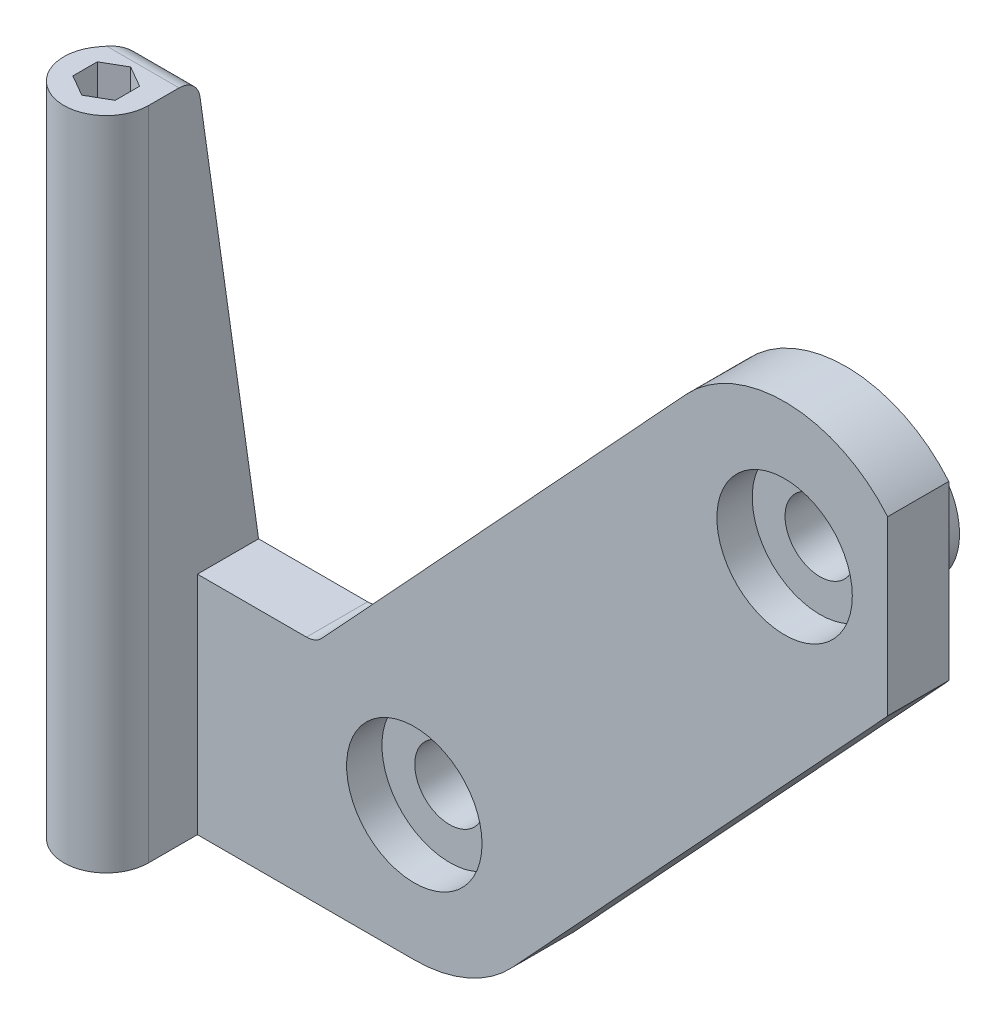
ISO-10303-21;
HEADER;
FILE_DESCRIPTION(('STEP AP214'),'2;1');
FILE_NAME('part.step','',(''),(''),'','','');
FILE_SCHEMA(('AUTOMOTIVE_DESIGN { 1 0 10303 214 1 1 1 1 }'));
ENDSEC;
DATA;
#1=APPLICATION_CONTEXT('core data for automotive mechanical design processes');
#2=APPLICATION_PROTOCOL_DEFINITION('international standard','automotive_design',2000,#1);
#3=PRODUCT_CONTEXT('',#1,'mechanical');
#4=PRODUCT('Part','Part','',(#3));
#5=PRODUCT_RELATED_PRODUCT_CATEGORY('part','',(#4));
#6=PRODUCT_DEFINITION_FORMATION('','',#4);
#7=PRODUCT_DEFINITION_CONTEXT('part definition',#1,'design');
#8=PRODUCT_DEFINITION('design','',#6,#7);
#9=PRODUCT_DEFINITION_SHAPE('','',#8);
#10=(LENGTH_UNIT() NAMED_UNIT(*) SI_UNIT(.MILLI.,.METRE.));
#11=(NAMED_UNIT(*) PLANE_ANGLE_UNIT() SI_UNIT($,.RADIAN.));
#12=(NAMED_UNIT(*) SI_UNIT($,.STERADIAN.) SOLID_ANGLE_UNIT());
#13=UNCERTAINTY_MEASURE_WITH_UNIT(LENGTH_MEASURE(1.E-05),#10,'distance_accuracy_value','');
#14=(GEOMETRIC_REPRESENTATION_CONTEXT(3) GLOBAL_UNCERTAINTY_ASSIGNED_CONTEXT((#13)) GLOBAL_UNIT_ASSIGNED_CONTEXT((#10,
#11,#12)) REPRESENTATION_CONTEXT('',''));
#15=CARTESIAN_POINT('',(0.,0.,0.));
#16=DIRECTION('',(0.,0.,1.));
#17=DIRECTION('',(1.,0.,0.));
#18=AXIS2_PLACEMENT_3D('',#15,#16,#17);
#19=CARTESIAN_POINT('',(-4.65938028001538,4.31424100001424,-18.2594591380867));
#20=DIRECTION('',(0.,1.,0.));
#21=DIRECTION('',(-1.,0.,0.));
#22=AXIS2_PLACEMENT_3D('',#19,#20,#21);
#23=PLANE('',#22);
#24=DIRECTION('',(-1.,0.,0.));
#25=VECTOR('',#24,1.);
#26=CARTESIAN_POINT('',(-4.65938028001538,4.31424100001424,1.445));
#27=LINE('',#26,#25);
#28=CARTESIAN_POINT('',(-5.0962965387542,4.31424100001424,1.445));
#29=VERTEX_POINT('',#28);
#30=CARTESIAN_POINT('',(-10.25,4.31424100001424,1.445));
#31=VERTEX_POINT('',#30);
#32=EDGE_CURVE('E230',#29,#31,#27,.T.);
#33=ORIENTED_EDGE('',*,*,#32,.F.);
#34=DIRECTION('',(0.,0.,-1.));
#35=VECTOR('',#34,1.);
#36=CARTESIAN_POINT('',(-5.0962965387542,4.31424100001424,-18.2594591380867));
#37=LINE('',#36,#35);
#38=CARTESIAN_POINT('',(-5.0962965387542,4.31424100001424,-1.445));
#39=VERTEX_POINT('',#38);
#40=EDGE_CURVE('E359',#29,#39,#37,.T.);
#41=ORIENTED_EDGE('',*,*,#40,.T.);
#42=DIRECTION('',(1.,0.,0.));
#43=VECTOR('',#42,1.);
#44=CARTESIAN_POINT('',(-4.65938028001538,4.31424100001424,-1.445));
#45=LINE('',#44,#43);
#46=CARTESIAN_POINT('',(-10.25,4.31424100001424,-1.445));
#47=VERTEX_POINT('',#46);
#48=EDGE_CURVE('E211',#47,#39,#45,.T.);
#49=ORIENTED_EDGE('',*,*,#48,.F.);
#50=DIRECTION('',(0.,0.,-1.));
#51=VECTOR('',#50,1.);
#52=CARTESIAN_POINT('',(-10.25,4.31424100001424,1.445));
#53=LINE('',#52,#51);
#54=EDGE_CURVE('E374',#31,#47,#53,.T.);
#55=ORIENTED_EDGE('',*,*,#54,.F.);
#56=EDGE_LOOP('',(#33,#41,#49,#55));
#57=FACE_BOUND('',#56,.T.);
#58=ADVANCED_FACE('F41',(#57),#23,.T.);
#59=CARTESIAN_POINT('',(0.,0.,1.445));
#60=DIRECTION('',(0.,0.,1.));
#61=DIRECTION('',(1.,0.,0.));
#62=AXIS2_PLACEMENT_3D('',#59,#60,#61);
#63=PLANE('',#62);
#64=CARTESIAN_POINT('',(0.,0.,1.445));
#65=DIRECTION('',(0.,0.,1.));
#66=DIRECTION('',(1.,0.,0.));
#67=AXIS2_PLACEMENT_3D('',#64,#65,#66);
#68=CIRCLE('',#67,3.2);
#69=CARTESIAN_POINT('',(3.2,0.,1.445));
#70=VERTEX_POINT('',#69);
#71=EDGE_CURVE('E282',#70,#70,#68,.T.);
#72=ORIENTED_EDGE('',*,*,#71,.F.);
#73=EDGE_LOOP('',(#72));
#74=FACE_BOUND('',#73,.T.);
#75=CARTESIAN_POINT('',(17.5,18.9,1.445));
#76=DIRECTION('',(0.,0.,1.));
#77=DIRECTION('',(1.,0.,0.));
#78=AXIS2_PLACEMENT_3D('',#75,#76,#77);
#79=CIRCLE('',#78,3.2);
#80=CARTESIAN_POINT('',(20.7,18.9,1.445));
#81=VERTEX_POINT('',#80);
#82=EDGE_CURVE('E290',#81,#81,#79,.T.);
#83=ORIENTED_EDGE('',*,*,#82,.F.);
#84=EDGE_LOOP('',(#83));
#85=FACE_BOUND('',#84,.T.);
#86=DIRECTION('',(-0.679408031498305,-0.733760674018169,0.));
#87=VECTOR('',#86,1.);
#88=CARTESIAN_POINT('',(-4.65938028001538,4.31424100001424,1.445));
#89=LINE('',#88,#87);
#90=CARTESIAN_POINT('',(12.8406197199846,23.2142410000142,1.445));
#91=VERTEX_POINT('',#90);
#92=CARTESIAN_POINT('',(-4.36253586473603,4.63483296851593,1.445));
#93=VERTEX_POINT('',#92);
#94=EDGE_CURVE('E306',#91,#93,#89,.T.);
#95=ORIENTED_EDGE('',*,*,#94,.T.);
#96=CARTESIAN_POINT('',(-5.0962965387542,5.31424100001424,1.445));
#97=DIRECTION('',(0.,0.,1.));
#98=DIRECTION('',(1.,0.,0.));
#99=AXIS2_PLACEMENT_3D('',#96,#97,#98);
#100=CIRCLE('',#99,1.);
#101=EDGE_CURVE('E11',#93,#29,#100,.F.);
#102=ORIENTED_EDGE('',*,*,#101,.T.);
#103=ORIENTED_EDGE('',*,*,#32,.T.);
#104=DIRECTION('',(0.,-1.,0.));
#105=VECTOR('',#104,1.);
#106=CARTESIAN_POINT('',(-10.25,24.65,1.445));
#107=LINE('',#106,#105);
#108=CARTESIAN_POINT('',(-10.25,-6.35,1.445));
#109=VERTEX_POINT('',#108);
#110=EDGE_CURVE('E343',#31,#109,#107,.T.);
#111=ORIENTED_EDGE('',*,*,#110,.T.);
#112=DIRECTION('',(1.,0.,0.));
#113=VECTOR('',#112,1.);
#114=CARTESIAN_POINT('',(0.,-6.35,1.445));
#115=LINE('',#114,#113);
#116=CARTESIAN_POINT('',(0.,-6.35,1.445));
#117=VERTEX_POINT('',#116);
#118=EDGE_CURVE('E237',#109,#117,#115,.T.);
#119=ORIENTED_EDGE('',*,*,#118,.T.);
#120=CARTESIAN_POINT('',(0.,0.,1.445));
#121=DIRECTION('',(0.,0.,1.));
#122=DIRECTION('',(1.,0.,0.));
#123=AXIS2_PLACEMENT_3D('',#120,#121,#122);
#124=CIRCLE('',#123,6.35);
#125=CARTESIAN_POINT('',(4.65938028001538,-4.31424100001424,1.445));
#126=VERTEX_POINT('',#125);
#127=EDGE_CURVE('E294',#117,#126,#124,.T.);
#128=ORIENTED_EDGE('',*,*,#127,.T.);
#129=DIRECTION('',(0.679408031498305,0.733760674018169,0.));
#130=VECTOR('',#129,1.);
#131=CARTESIAN_POINT('',(4.65938028001538,-4.31424100001424,1.445));
#132=LINE('',#131,#130);
#133=CARTESIAN_POINT('',(22.1593802800154,14.5857589999858,1.445));
#134=VERTEX_POINT('',#133);
#135=EDGE_CURVE('E297',#126,#134,#132,.T.);
#136=ORIENTED_EDGE('',*,*,#135,.T.);
#137=CARTESIAN_POINT('',(17.5,18.9,1.445));
#138=DIRECTION('',(0.,0.,1.));
#139=DIRECTION('',(1.,0.,0.));
#140=AXIS2_PLACEMENT_3D('',#137,#138,#139);
#141=CIRCLE('',#140,6.35);
#142=CARTESIAN_POINT('',(22.37,14.8250030674858,1.445));
#143=VERTEX_POINT('',#142);
#144=EDGE_CURVE('E302',#134,#143,#141,.T.);
#145=ORIENTED_EDGE('',*,*,#144,.T.);
#146=DIRECTION('',(0.,-1.,0.));
#147=VECTOR('',#146,1.);
#148=CARTESIAN_POINT('',(22.37,14.8250030674858,1.445));
#149=LINE('',#148,#147);
#150=CARTESIAN_POINT('',(22.37,22.9749969325142,1.445));
#151=VERTEX_POINT('',#150);
#152=EDGE_CURVE('E246',#151,#143,#149,.T.);
#153=ORIENTED_EDGE('',*,*,#152,.F.);
#154=EDGE_CURVE('E301',#151,#91,#141,.T.);
#155=ORIENTED_EDGE('',*,*,#154,.T.);
#156=EDGE_LOOP('',(#95,#102,#103,#111,#119,#128,#136,#145,#153,#155));
#157=FACE_BOUND('',#156,.T.);
#158=ADVANCED_FACE('F380',(#74,#85,#157),#63,.T.);
#159=CARTESIAN_POINT('',(17.5,18.9,1.445));
#160=DIRECTION('',(0.,0.,-1.));
#161=DIRECTION('',(-1.,0.,0.));
#162=AXIS2_PLACEMENT_3D('',#159,#160,#161);
#163=CYLINDRICAL_SURFACE('',#162,6.35);
#164=ORIENTED_EDGE('',*,*,#154,.F.);
#165=DIRECTION('',(0.,0.,1.));
#166=VECTOR('',#165,1.);
#167=CARTESIAN_POINT('',(22.37,22.9749969325142,-3.625));
#168=LINE('',#167,#166);
#169=CARTESIAN_POINT('',(22.37,22.9749969325142,-1.445));
#170=VERTEX_POINT('',#169);
#171=EDGE_CURVE('E260',#170,#151,#168,.T.);
#172=ORIENTED_EDGE('',*,*,#171,.F.);
#173=CARTESIAN_POINT('',(17.5,18.9,-1.445));
#174=DIRECTION('',(0.,0.,1.));
#175=DIRECTION('',(1.,0.,0.));
#176=AXIS2_PLACEMENT_3D('',#173,#174,#175);
#177=CIRCLE('',#176,6.35);
#178=CARTESIAN_POINT('',(12.8406197199846,23.2142410000142,-1.445));
#179=VERTEX_POINT('',#178);
#180=EDGE_CURVE('E315',#170,#179,#177,.T.);
#181=ORIENTED_EDGE('',*,*,#180,.T.);
#182=DIRECTION('',(0.,0.,-1.));
#183=VECTOR('',#182,1.);
#184=CARTESIAN_POINT('',(12.8406197199846,23.2142410000142,1.445));
#185=LINE('',#184,#183);
#186=EDGE_CURVE('E309',#91,#179,#185,.T.);
#187=ORIENTED_EDGE('',*,*,#186,.F.);
#188=EDGE_LOOP('',(#164,#172,#181,#187));
#189=FACE_BOUND('',#188,.T.);
#190=ADVANCED_FACE('F388',(#189),#163,.T.);
#191=CARTESIAN_POINT('',(0.,0.,1.445));
#192=DIRECTION('',(0.,0.,-1.));
#193=DIRECTION('',(-1.,0.,0.));
#194=AXIS2_PLACEMENT_3D('',#191,#192,#193);
#195=CYLINDRICAL_SURFACE('',#194,6.35);
#196=ORIENTED_EDGE('',*,*,#127,.F.);
#197=DIRECTION('',(0.,0.,1.));
#198=VECTOR('',#197,1.);
#199=CARTESIAN_POINT('',(0.,-6.35,-18.2594591380867));
#200=LINE('',#199,#198);
#201=CARTESIAN_POINT('',(0.,-6.35,-1.445));
#202=VERTEX_POINT('',#201);
#203=EDGE_CURVE('E218',#202,#117,#200,.T.);
#204=ORIENTED_EDGE('',*,*,#203,.F.);
#205=CARTESIAN_POINT('',(0.,0.,-1.445));
#206=DIRECTION('',(0.,0.,1.));
#207=DIRECTION('',(1.,0.,0.));
#208=AXIS2_PLACEMENT_3D('',#205,#206,#207);
#209=CIRCLE('',#208,6.35);
#210=CARTESIAN_POINT('',(4.65938028001538,-4.31424100001424,-1.445));
#211=VERTEX_POINT('',#210);
#212=EDGE_CURVE('E281',#202,#211,#209,.T.);
#213=ORIENTED_EDGE('',*,*,#212,.T.);
#214=DIRECTION('',(0.,0.,-1.));
#215=VECTOR('',#214,1.);
#216=CARTESIAN_POINT('',(4.65938028001538,-4.31424100001424,1.445));
#217=LINE('',#216,#215);
#218=EDGE_CURVE('E329',#126,#211,#217,.T.);
#219=ORIENTED_EDGE('',*,*,#218,.F.);
#220=EDGE_LOOP('',(#196,#204,#213,#219));
#221=FACE_BOUND('',#220,.T.);
#222=ADVANCED_FACE('F403',(#221),#195,.T.);
#223=CARTESIAN_POINT('',(4.65938028001538,-4.31424100001424,1.445));
#224=DIRECTION('',(-0.733760674018169,0.679408031498305,0.));
#225=DIRECTION('',(-0.679408031498305,-0.733760674018169,0.));
#226=AXIS2_PLACEMENT_3D('',#223,#224,#225);
#227=PLANE('',#226);
#228=DIRECTION('',(0.679408031498305,0.733760674018169,0.));
#229=VECTOR('',#228,1.);
#230=CARTESIAN_POINT('',(4.65938028001538,-4.31424100001424,-1.445));
#231=LINE('',#230,#229);
#232=CARTESIAN_POINT('',(22.1593802800154,14.5857589999858,-1.445));
#233=VERTEX_POINT('',#232);
#234=EDGE_CURVE('E312',#211,#233,#231,.T.);
#235=ORIENTED_EDGE('',*,*,#234,.T.);
#236=DIRECTION('',(0.,0.,-1.));
#237=VECTOR('',#236,1.);
#238=CARTESIAN_POINT('',(22.1593802800154,14.5857589999858,1.445));
#239=LINE('',#238,#237);
#240=EDGE_CURVE('E325',#134,#233,#239,.T.);
#241=ORIENTED_EDGE('',*,*,#240,.F.);
#242=ORIENTED_EDGE('',*,*,#135,.F.);
#243=ORIENTED_EDGE('',*,*,#218,.T.);
#244=EDGE_LOOP('',(#235,#241,#242,#243));
#245=FACE_BOUND('',#244,.T.);
#246=ADVANCED_FACE('F400',(#245),#227,.F.);
#247=CARTESIAN_POINT('',(22.37,14.8250030674858,-1.445));
#248=VERTEX_POINT('',#247);
#249=EDGE_CURVE('E316',#233,#248,#177,.T.);
#250=ORIENTED_EDGE('',*,*,#249,.T.);
#251=DIRECTION('',(0.,0.,1.));
#252=VECTOR('',#251,1.);
#253=CARTESIAN_POINT('',(22.37,14.8250030674858,-3.625));
#254=LINE('',#253,#252);
#255=EDGE_CURVE('E261',#248,#143,#254,.T.);
#256=ORIENTED_EDGE('',*,*,#255,.T.);
#257=ORIENTED_EDGE('',*,*,#144,.F.);
#258=ORIENTED_EDGE('',*,*,#240,.T.);
#259=EDGE_LOOP('',(#250,#256,#257,#258));
#260=FACE_BOUND('',#259,.T.);
#261=ADVANCED_FACE('F395',(#260),#163,.T.);
#262=CARTESIAN_POINT('',(-4.65938028001538,4.31424100001424,1.445));
#263=DIRECTION('',(0.733760674018169,-0.679408031498305,0.));
#264=DIRECTION('',(0.679408031498305,0.733760674018169,0.));
#265=AXIS2_PLACEMENT_3D('',#262,#263,#264);
#266=PLANE('',#265);
#267=DIRECTION('',(-0.679408031498305,-0.733760674018169,0.));
#268=VECTOR('',#267,1.);
#269=CARTESIAN_POINT('',(-4.65938028001538,4.31424100001424,-1.445));
#270=LINE('',#269,#268);
#271=CARTESIAN_POINT('',(-4.36253586473603,4.63483296851593,-1.445));
#272=VERTEX_POINT('',#271);
#273=EDGE_CURVE('E298',#179,#272,#270,.T.);
#274=ORIENTED_EDGE('',*,*,#273,.T.);
#275=DIRECTION('',(0.,0.,-1.));
#276=VECTOR('',#275,1.);
#277=CARTESIAN_POINT('',(-4.36253586473603,4.63483296851593,1.445));
#278=LINE('',#277,#276);
#279=EDGE_CURVE('E57',#272,#93,#278,.F.);
#280=ORIENTED_EDGE('',*,*,#279,.T.);
#281=ORIENTED_EDGE('',*,*,#94,.F.);
#282=ORIENTED_EDGE('',*,*,#186,.T.);
#283=EDGE_LOOP('',(#274,#280,#281,#282));
#284=FACE_BOUND('',#283,.T.);
#285=ADVANCED_FACE('F384',(#284),#266,.F.);
#286=CARTESIAN_POINT('',(0.,0.,-1.445));
#287=DIRECTION('',(0.,0.,1.));
#288=DIRECTION('',(1.,0.,0.));
#289=AXIS2_PLACEMENT_3D('',#286,#287,#288);
#290=PLANE('',#289);
#291=CARTESIAN_POINT('',(17.5,18.9,-1.445));
#292=DIRECTION('',(0.,0.,1.));
#293=DIRECTION('',(1.,0.,0.));
#294=AXIS2_PLACEMENT_3D('',#291,#292,#293);
#295=CIRCLE('',#294,3.2);
#296=CARTESIAN_POINT('',(20.7,18.9,-1.445));
#297=VERTEX_POINT('',#296);
#298=EDGE_CURVE('E271',#297,#297,#295,.T.);
#299=ORIENTED_EDGE('',*,*,#298,.T.);
#300=EDGE_LOOP('',(#299));
#301=FACE_BOUND('',#300,.T.);
#302=CARTESIAN_POINT('',(0.,0.,-1.445));
#303=DIRECTION('',(0.,0.,1.));
#304=DIRECTION('',(1.,0.,0.));
#305=AXIS2_PLACEMENT_3D('',#302,#303,#304);
#306=CIRCLE('',#305,3.2);
#307=CARTESIAN_POINT('',(3.2,0.,-1.445));
#308=VERTEX_POINT('',#307);
#309=EDGE_CURVE('E276',#308,#308,#306,.T.);
#310=ORIENTED_EDGE('',*,*,#309,.T.);
#311=EDGE_LOOP('',(#310));
#312=FACE_BOUND('',#311,.T.);
#313=ORIENTED_EDGE('',*,*,#180,.F.);
#314=DIRECTION('',(0.,-1.,0.));
#315=VECTOR('',#314,1.);
#316=CARTESIAN_POINT('',(22.37,0.,-1.445));
#317=LINE('',#316,#315);
#318=EDGE_CURVE('E333',#170,#248,#317,.T.);
#319=ORIENTED_EDGE('',*,*,#318,.T.);
#320=ORIENTED_EDGE('',*,*,#249,.F.);
#321=ORIENTED_EDGE('',*,*,#234,.F.);
#322=ORIENTED_EDGE('',*,*,#212,.F.);
#323=DIRECTION('',(-1.,0.,0.));
#324=VECTOR('',#323,1.);
#325=CARTESIAN_POINT('',(0.,-6.35,-1.445));
#326=LINE('',#325,#324);
#327=CARTESIAN_POINT('',(-13.,-6.35,-1.445));
#328=VERTEX_POINT('',#327);
#329=EDGE_CURVE('E216',#202,#328,#326,.T.);
#330=ORIENTED_EDGE('',*,*,#329,.T.);
#331=DIRECTION('',(0.,1.,0.));
#332=VECTOR('',#331,1.);
#333=CARTESIAN_POINT('',(-13.,4.31424100001424,-1.445));
#334=LINE('',#333,#332);
#335=CARTESIAN_POINT('',(-13.,4.31424100001424,-1.445));
#336=VERTEX_POINT('',#335);
#337=EDGE_CURVE('E194',#328,#336,#334,.T.);
#338=ORIENTED_EDGE('',*,*,#337,.T.);
#339=EDGE_CURVE('E205',#336,#47,#45,.T.);
#340=ORIENTED_EDGE('',*,*,#339,.T.);
#341=ORIENTED_EDGE('',*,*,#48,.T.);
#342=CARTESIAN_POINT('',(-5.0962965387542,5.31424100001424,-1.445));
#343=DIRECTION('',(0.,0.,1.));
#344=DIRECTION('',(1.,0.,0.));
#345=AXIS2_PLACEMENT_3D('',#342,#343,#344);
#346=CIRCLE('',#345,1.);
#347=EDGE_CURVE('E50',#39,#272,#346,.T.);
#348=ORIENTED_EDGE('',*,*,#347,.T.);
#349=ORIENTED_EDGE('',*,*,#273,.F.);
#350=EDGE_LOOP('',(#313,#319,#320,#321,#322,#330,#338,#340,#341,#348,#349));
#351=FACE_BOUND('',#350,.T.);
#352=ADVANCED_FACE('F214',(#301,#312,#351),#290,.F.);
#353=CARTESIAN_POINT('',(17.5,18.9,-0.225));
#354=DIRECTION('',(0.,0.,1.));
#355=DIRECTION('',(1.,0.,0.));
#356=AXIS2_PLACEMENT_3D('',#353,#354,#355);
#357=CYLINDRICAL_SURFACE('',#356,3.2);
#358=CARTESIAN_POINT('',(17.5,18.9,-0.225));
#359=DIRECTION('',(0.,0.,1.));
#360=DIRECTION('',(1.,0.,0.));
#361=AXIS2_PLACEMENT_3D('',#358,#359,#360);
#362=CIRCLE('',#361,3.2);
#363=CARTESIAN_POINT('',(20.7,18.9,-0.225));
#364=VERTEX_POINT('',#363);
#365=EDGE_CURVE('E286',#364,#364,#362,.T.);
#366=ORIENTED_EDGE('',*,*,#365,.F.);
#367=EDGE_LOOP('',(#366));
#368=FACE_BOUND('',#367,.T.);
#369=ORIENTED_EDGE('',*,*,#82,.T.);
#370=EDGE_LOOP('',(#369));
#371=FACE_BOUND('',#370,.T.);
#372=ADVANCED_FACE('F590',(#368,#371),#357,.F.);
#373=CARTESIAN_POINT('',(17.5,18.9,-0.225));
#374=DIRECTION('',(0.,0.,1.));
#375=DIRECTION('',(1.,0.,0.));
#376=AXIS2_PLACEMENT_3D('',#373,#374,#375);
#377=PLANE('',#376);
#378=CARTESIAN_POINT('',(17.5,18.9,-0.225));
#379=DIRECTION('',(0.,0.,1.));
#380=DIRECTION('',(1.,0.,0.));
#381=AXIS2_PLACEMENT_3D('',#378,#379,#380);
#382=CIRCLE('',#381,1.65);
#383=CARTESIAN_POINT('',(19.15,18.9,-0.225));
#384=VERTEX_POINT('',#383);
#385=EDGE_CURVE('E210',#384,#384,#382,.T.);
#386=ORIENTED_EDGE('',*,*,#385,.F.);
#387=EDGE_LOOP('',(#386));
#388=FACE_BOUND('',#387,.T.);
#389=ORIENTED_EDGE('',*,*,#365,.T.);
#390=EDGE_LOOP('',(#389));
#391=FACE_BOUND('',#390,.T.);
#392=ADVANCED_FACE('F586',(#388,#391),#377,.T.);
#393=CARTESIAN_POINT('',(0.,0.,-0.225));
#394=DIRECTION('',(0.,0.,1.));
#395=DIRECTION('',(1.,0.,0.));
#396=AXIS2_PLACEMENT_3D('',#393,#394,#395);
#397=CYLINDRICAL_SURFACE('',#396,3.2);
#398=CARTESIAN_POINT('',(0.,0.,-0.225));
#399=DIRECTION('',(0.,0.,1.));
#400=DIRECTION('',(1.,0.,0.));
#401=AXIS2_PLACEMENT_3D('',#398,#399,#400);
#402=CIRCLE('',#401,3.2);
#403=CARTESIAN_POINT('',(3.2,0.,-0.225));
#404=VERTEX_POINT('',#403);
#405=EDGE_CURVE('E277',#404,#404,#402,.T.);
#406=ORIENTED_EDGE('',*,*,#405,.F.);
#407=EDGE_LOOP('',(#406));
#408=FACE_BOUND('',#407,.T.);
#409=ORIENTED_EDGE('',*,*,#71,.T.);
#410=EDGE_LOOP('',(#409));
#411=FACE_BOUND('',#410,.T.);
#412=ADVANCED_FACE('F582',(#408,#411),#397,.F.);
#413=CARTESIAN_POINT('',(0.,0.,-0.225));
#414=DIRECTION('',(0.,0.,1.));
#415=DIRECTION('',(1.,0.,0.));
#416=AXIS2_PLACEMENT_3D('',#413,#414,#415);
#417=PLANE('',#416);
#418=CARTESIAN_POINT('',(0.,0.,-0.225));
#419=DIRECTION('',(0.,0.,1.));
#420=DIRECTION('',(1.,0.,0.));
#421=AXIS2_PLACEMENT_3D('',#418,#419,#420);
#422=CIRCLE('',#421,1.65);
#423=CARTESIAN_POINT('',(1.65,0.,-0.225));
#424=VERTEX_POINT('',#423);
#425=EDGE_CURVE('E247',#424,#424,#422,.T.);
#426=ORIENTED_EDGE('',*,*,#425,.F.);
#427=EDGE_LOOP('',(#426));
#428=FACE_BOUND('',#427,.T.);
#429=ORIENTED_EDGE('',*,*,#405,.T.);
#430=EDGE_LOOP('',(#429));
#431=FACE_BOUND('',#430,.T.);
#432=ADVANCED_FACE('F578',(#428,#431),#417,.T.);
#433=CARTESIAN_POINT('',(0.,0.,-3.625));
#434=DIRECTION('',(0.,0.,1.));
#435=DIRECTION('',(1.,0.,0.));
#436=AXIS2_PLACEMENT_3D('',#433,#434,#435);
#437=CYLINDRICAL_SURFACE('',#436,3.2);
#438=CARTESIAN_POINT('',(0.,0.,-3.625));
#439=DIRECTION('',(0.,0.,1.));
#440=DIRECTION('',(1.,0.,0.));
#441=AXIS2_PLACEMENT_3D('',#438,#439,#440);
#442=CIRCLE('',#441,3.2);
#443=CARTESIAN_POINT('',(3.2,0.,-3.625));
#444=VERTEX_POINT('',#443);
#445=EDGE_CURVE('E272',#444,#444,#442,.T.);
#446=ORIENTED_EDGE('',*,*,#445,.T.);
#447=EDGE_LOOP('',(#446));
#448=FACE_BOUND('',#447,.T.);
#449=ORIENTED_EDGE('',*,*,#309,.F.);
#450=EDGE_LOOP('',(#449));
#451=FACE_BOUND('',#450,.T.);
#452=ADVANCED_FACE('F574',(#448,#451),#437,.T.);
#453=CARTESIAN_POINT('',(0.,0.,-3.625));
#454=DIRECTION('',(0.,0.,1.));
#455=DIRECTION('',(1.,0.,0.));
#456=AXIS2_PLACEMENT_3D('',#453,#454,#455);
#457=PLANE('',#456);
#458=CARTESIAN_POINT('',(0.,0.,-3.625));
#459=DIRECTION('',(0.,0.,1.));
#460=DIRECTION('',(1.,0.,0.));
#461=AXIS2_PLACEMENT_3D('',#458,#459,#460);
#462=CIRCLE('',#461,1.65);
#463=CARTESIAN_POINT('',(1.65,0.,-3.625));
#464=VERTEX_POINT('',#463);
#465=EDGE_CURVE('E242',#464,#464,#462,.T.);
#466=ORIENTED_EDGE('',*,*,#465,.T.);
#467=EDGE_LOOP('',(#466));
#468=FACE_BOUND('',#467,.T.);
#469=ORIENTED_EDGE('',*,*,#445,.F.);
#470=EDGE_LOOP('',(#469));
#471=FACE_BOUND('',#470,.T.);
#472=ADVANCED_FACE('F570',(#468,#471),#457,.F.);
#473=CARTESIAN_POINT('',(17.5,18.9,-3.625));
#474=DIRECTION('',(0.,0.,1.));
#475=DIRECTION('',(1.,0.,0.));
#476=AXIS2_PLACEMENT_3D('',#473,#474,#475);
#477=CYLINDRICAL_SURFACE('',#476,3.2);
#478=CARTESIAN_POINT('',(17.5,18.9,-3.625));
#479=DIRECTION('',(0.,0.,1.));
#480=DIRECTION('',(1.,0.,0.));
#481=AXIS2_PLACEMENT_3D('',#478,#479,#480);
#482=CIRCLE('',#481,3.2);
#483=CARTESIAN_POINT('',(20.7,18.9,-3.625));
#484=VERTEX_POINT('',#483);
#485=EDGE_CURVE('E265',#484,#484,#482,.T.);
#486=ORIENTED_EDGE('',*,*,#485,.T.);
#487=EDGE_LOOP('',(#486));
#488=FACE_BOUND('',#487,.T.);
#489=ORIENTED_EDGE('',*,*,#298,.F.);
#490=EDGE_LOOP('',(#489));
#491=FACE_BOUND('',#490,.T.);
#492=ADVANCED_FACE('F566',(#488,#491),#477,.T.);
#493=CARTESIAN_POINT('',(17.5,18.9,-3.625));
#494=DIRECTION('',(0.,0.,1.));
#495=DIRECTION('',(1.,0.,0.));
#496=AXIS2_PLACEMENT_3D('',#493,#494,#495);
#497=PLANE('',#496);
#498=CARTESIAN_POINT('',(17.5,18.9,-3.625));
#499=DIRECTION('',(0.,0.,1.));
#500=DIRECTION('',(1.,0.,0.));
#501=AXIS2_PLACEMENT_3D('',#498,#499,#500);
#502=CIRCLE('',#501,1.65);
#503=CARTESIAN_POINT('',(19.15,18.9,-3.625));
#504=VERTEX_POINT('',#503);
#505=EDGE_CURVE('E251',#504,#504,#502,.T.);
#506=ORIENTED_EDGE('',*,*,#505,.T.);
#507=EDGE_LOOP('',(#506));
#508=FACE_BOUND('',#507,.T.);
#509=ORIENTED_EDGE('',*,*,#485,.F.);
#510=EDGE_LOOP('',(#509));
#511=FACE_BOUND('',#510,.T.);
#512=ADVANCED_FACE('F563',(#508,#511),#497,.F.);
#513=CARTESIAN_POINT('',(22.37,14.8250030674858,-3.625));
#514=DIRECTION('',(-1.,0.,0.));
#515=DIRECTION('',(0.,0.,1.));
#516=AXIS2_PLACEMENT_3D('',#513,#514,#515);
#517=PLANE('',#516);
#518=ORIENTED_EDGE('',*,*,#171,.T.);
#519=ORIENTED_EDGE('',*,*,#152,.T.);
#520=ORIENTED_EDGE('',*,*,#255,.F.);
#521=ORIENTED_EDGE('',*,*,#318,.F.);
#522=EDGE_LOOP('',(#518,#519,#520,#521));
#523=FACE_BOUND('',#522,.T.);
#524=ADVANCED_FACE('F390',(#523),#517,.F.);
#525=CARTESIAN_POINT('',(17.5,18.9,-3.625));
#526=DIRECTION('',(0.,0.,1.));
#527=DIRECTION('',(1.,0.,0.));
#528=AXIS2_PLACEMENT_3D('',#525,#526,#527);
#529=CYLINDRICAL_SURFACE('',#528,1.65);
#530=ORIENTED_EDGE('',*,*,#505,.F.);
#531=EDGE_LOOP('',(#530));
#532=FACE_BOUND('',#531,.T.);
#533=ORIENTED_EDGE('',*,*,#385,.T.);
#534=EDGE_LOOP('',(#533));
#535=FACE_BOUND('',#534,.T.);
#536=ADVANCED_FACE('F556',(#532,#535),#529,.F.);
#537=CARTESIAN_POINT('',(0.,0.,-3.625));
#538=DIRECTION('',(0.,0.,1.));
#539=DIRECTION('',(1.,0.,0.));
#540=AXIS2_PLACEMENT_3D('',#537,#538,#539);
#541=CYLINDRICAL_SURFACE('',#540,1.65);
#542=ORIENTED_EDGE('',*,*,#465,.F.);
#543=EDGE_LOOP('',(#542));
#544=FACE_BOUND('',#543,.T.);
#545=ORIENTED_EDGE('',*,*,#425,.T.);
#546=EDGE_LOOP('',(#545));
#547=FACE_BOUND('',#546,.T.);
#548=ADVANCED_FACE('F554',(#544,#547),#541,.F.);
#549=CARTESIAN_POINT('',(0.,-6.35,-18.2594591380867));
#550=DIRECTION('',(0.,-1.,0.));
#551=DIRECTION('',(1.,0.,0.));
#552=AXIS2_PLACEMENT_3D('',#549,#550,#551);
#553=PLANE('',#552);
#554=ORIENTED_EDGE('',*,*,#329,.F.);
#555=ORIENTED_EDGE('',*,*,#203,.T.);
#556=ORIENTED_EDGE('',*,*,#118,.F.);
#557=DIRECTION('',(0.,0.,-1.));
#558=VECTOR('',#557,1.);
#559=CARTESIAN_POINT('',(-10.25,-6.35,0.));
#560=LINE('',#559,#558);
#561=CARTESIAN_POINT('',(-10.25,-6.35,3.755));
#562=VERTEX_POINT('',#561);
#563=EDGE_CURVE('E474',#562,#109,#560,.T.);
#564=ORIENTED_EDGE('',*,*,#563,.F.);
#565=CARTESIAN_POINT('',(-12.25,-6.35,3.755));
#566=DIRECTION('',(0.,-1.,0.));
#567=DIRECTION('',(1.,0.,0.));
#568=AXIS2_PLACEMENT_3D('',#565,#566,#567);
#569=CIRCLE('',#568,2.);
#570=CARTESIAN_POINT('',(-13.8378147189029,-6.35,2.53892252778233));
#571=VERTEX_POINT('',#570);
#572=EDGE_CURVE('E477',#562,#571,#569,.T.);
#573=ORIENTED_EDGE('',*,*,#572,.T.);
#574=DIRECTION('',(-0.608038736108837,0.,0.793907359451446));
#575=VECTOR('',#574,1.);
#576=CARTESIAN_POINT('',(-7.49621595245119,-6.35,-5.74121101040894));
#577=LINE('',#576,#575);
#578=CARTESIAN_POINT('',(-13.,-6.35,1.445));
#579=VERTEX_POINT('',#578);
#580=EDGE_CURVE('E411',#579,#571,#577,.T.);
#581=ORIENTED_EDGE('',*,*,#580,.F.);
#582=DIRECTION('',(0.,0.,1.));
#583=VECTOR('',#582,1.);
#584=CARTESIAN_POINT('',(-13.,-6.35,-18.2594591380867));
#585=LINE('',#584,#583);
#586=EDGE_CURVE('E224',#328,#579,#585,.T.);
#587=ORIENTED_EDGE('',*,*,#586,.F.);
#588=EDGE_LOOP('',(#554,#555,#556,#564,#573,#581,#587));
#589=FACE_BOUND('',#588,.T.);
#590=DIRECTION('',(0.866025403784439,0.,-0.5));
#591=VECTOR('',#590,1.);
#592=CARTESIAN_POINT('',(-1.93653730439471,-6.35,-3.35418100196412));
#593=LINE('',#592,#591);
#594=CARTESIAN_POINT('',(-13.25,-6.35,3.17764973081037));
#595=VERTEX_POINT('',#594);
#596=CARTESIAN_POINT('',(-12.25,-6.35,2.60029946162075));
#597=VERTEX_POINT('',#596);
#598=EDGE_CURVE('E424',#595,#597,#593,.T.);
#599=ORIENTED_EDGE('',*,*,#598,.F.);
#600=DIRECTION('',(0.,0.,-1.));
#601=VECTOR('',#600,1.);
#602=CARTESIAN_POINT('',(-13.25,-6.35,0.));
#603=LINE('',#602,#601);
#604=CARTESIAN_POINT('',(-13.25,-6.35,4.33235026918963));
#605=VERTEX_POINT('',#604);
#606=EDGE_CURVE('E459',#605,#595,#603,.T.);
#607=ORIENTED_EDGE('',*,*,#606,.F.);
#608=DIRECTION('',(-0.866025403784439,0.,-0.5));
#609=VECTOR('',#608,1.);
#610=CARTESIAN_POINT('',(-5.18846269560528,-6.35,8.98668100196413));
#611=LINE('',#610,#609);
#612=CARTESIAN_POINT('',(-12.25,-6.35,4.90970053837925));
#613=VERTEX_POINT('',#612);
#614=EDGE_CURVE('E462',#613,#605,#611,.T.);
#615=ORIENTED_EDGE('',*,*,#614,.F.);
#616=DIRECTION('',(-0.866025403784439,0.,0.499999999999999));
#617=VECTOR('',#616,1.);
#618=CARTESIAN_POINT('',(-0.936537304394708,-6.35,-1.62213019439524));
#619=LINE('',#618,#617);
#620=CARTESIAN_POINT('',(-11.25,-6.35,4.33235026918963));
#621=VERTEX_POINT('',#620);
#622=EDGE_CURVE('E465',#621,#613,#619,.T.);
#623=ORIENTED_EDGE('',*,*,#622,.F.);
#624=DIRECTION('',(0.,0.,1.));
#625=VECTOR('',#624,1.);
#626=CARTESIAN_POINT('',(-11.25,-6.35,0.));
#627=LINE('',#626,#625);
#628=CARTESIAN_POINT('',(-11.25,-6.35,3.17764973081038));
#629=VERTEX_POINT('',#628);
#630=EDGE_CURVE('E468',#629,#621,#627,.T.);
#631=ORIENTED_EDGE('',*,*,#630,.F.);
#632=DIRECTION('',(0.866025403784439,0.,0.5));
#633=VECTOR('',#632,1.);
#634=CARTESIAN_POINT('',(-4.18846269560528,-6.35,7.25463019439525));
#635=LINE('',#634,#633);
#636=EDGE_CURVE('E471',#597,#629,#635,.T.);
#637=ORIENTED_EDGE('',*,*,#636,.F.);
#638=EDGE_LOOP('',(#599,#607,#615,#623,#631,#637));
#639=FACE_BOUND('',#638,.T.);
#640=ADVANCED_FACE('F406',(#589,#639),#553,.T.);
#641=CARTESIAN_POINT('',(-13.,4.31424100001424,-18.2594591380867));
#642=DIRECTION('',(-1.,0.,0.));
#643=DIRECTION('',(0.,0.,1.));
#644=AXIS2_PLACEMENT_3D('',#641,#642,#643);
#645=PLANE('',#644);
#646=DIRECTION('',(0.,-1.,0.));
#647=VECTOR('',#646,1.);
#648=CARTESIAN_POINT('',(-13.,4.31424100001424,1.445));
#649=LINE('',#648,#647);
#650=CARTESIAN_POINT('',(-13.,24.1466803335028,1.445));
#651=VERTEX_POINT('',#650);
#652=EDGE_CURVE('E233',#651,#579,#649,.T.);
#653=ORIENTED_EDGE('',*,*,#652,.F.);
#654=CARTESIAN_POINT('',(-13.,23.65,2.31293354947917));
#655=DIRECTION('',(-1.,0.,0.));
#656=DIRECTION('',(0.,0.,1.));
#657=AXIS2_PLACEMENT_3D('',#654,#655,#656);
#658=CIRCLE('',#657,1.);
#659=CARTESIAN_POINT('',(-13.,23.7907004717666,1.32288134012622));
#660=VERTEX_POINT('',#659);
#661=EDGE_CURVE('E197',#651,#660,#658,.T.);
#662=ORIENTED_EDGE('',*,*,#661,.T.);
#663=DIRECTION('',(0.,-0.990052209352948,-0.140700471766607));
#664=VECTOR('',#663,1.);
#665=CARTESIAN_POINT('',(-13.,4.31424100001424,-1.445));
#666=LINE('',#665,#664);
#667=EDGE_CURVE('E188',#660,#336,#666,.T.);
#668=ORIENTED_EDGE('',*,*,#667,.T.);
#669=ORIENTED_EDGE('',*,*,#337,.F.);
#670=ORIENTED_EDGE('',*,*,#586,.T.);
#671=EDGE_LOOP('',(#653,#662,#668,#669,#670));
#672=FACE_BOUND('',#671,.T.);
#673=ADVANCED_FACE('F191',(#672),#645,.T.);
#674=CARTESIAN_POINT('',(-10.25,24.65,0.));
#675=DIRECTION('',(-1.,0.,0.));
#676=DIRECTION('',(0.,-1.,0.));
#677=AXIS2_PLACEMENT_3D('',#674,#675,#676);
#678=PLANE('',#677);
#679=DIRECTION('',(0.,0.990052209352948,0.140700471766607));
#680=VECTOR('',#679,1.);
#681=CARTESIAN_POINT('',(-10.25,4.31424100001423,-1.445));
#682=LINE('',#681,#680);
#683=CARTESIAN_POINT('',(-10.25,23.7907004717666,1.32288134012622));
#684=VERTEX_POINT('',#683);
#685=EDGE_CURVE('E201',#47,#684,#682,.T.);
#686=ORIENTED_EDGE('',*,*,#685,.T.);
#687=CARTESIAN_POINT('',(-10.25,23.65,2.31293354947917));
#688=DIRECTION('',(-1.,0.,0.));
#689=DIRECTION('',(0.,-1.,0.));
#690=AXIS2_PLACEMENT_3D('',#687,#688,#689);
#691=CIRCLE('',#690,1.);
#692=CARTESIAN_POINT('',(-10.25,24.65,2.31293354947917));
#693=VERTEX_POINT('',#692);
#694=EDGE_CURVE('E356',#684,#693,#691,.F.);
#695=ORIENTED_EDGE('',*,*,#694,.T.);
#696=DIRECTION('',(0.,0.,-1.));
#697=VECTOR('',#696,1.);
#698=CARTESIAN_POINT('',(-10.25,24.65,0.));
#699=LINE('',#698,#697);
#700=CARTESIAN_POINT('',(-10.25,24.65,3.755));
#701=VERTEX_POINT('',#700);
#702=EDGE_CURVE('E446',#701,#693,#699,.T.);
#703=ORIENTED_EDGE('',*,*,#702,.F.);
#704=DIRECTION('',(0.,-1.,0.));
#705=VECTOR('',#704,1.);
#706=CARTESIAN_POINT('',(-10.25,24.65,3.755));
#707=LINE('',#706,#705);
#708=EDGE_CURVE('E484',#701,#562,#707,.T.);
#709=ORIENTED_EDGE('',*,*,#708,.T.);
#710=ORIENTED_EDGE('',*,*,#563,.T.);
#711=ORIENTED_EDGE('',*,*,#110,.F.);
#712=ORIENTED_EDGE('',*,*,#54,.T.);
#713=EDGE_LOOP('',(#686,#695,#703,#709,#710,#711,#712));
#714=FACE_BOUND('',#713,.T.);
#715=ADVANCED_FACE('F418',(#714),#678,.F.);
#716=CARTESIAN_POINT('',(-7.4962159524512,24.65,-5.74121101040894));
#717=DIRECTION('',(0.793907359451446,0.,0.608038736108837));
#718=DIRECTION('',(0.608038736108837,0.,-0.793907359451446));
#719=AXIS2_PLACEMENT_3D('',#716,#717,#718);
#720=PLANE('',#719);
#721=DIRECTION('',(-0.608038736108837,0.,0.793907359451446));
#722=VECTOR('',#721,1.);
#723=CARTESIAN_POINT('',(-7.4962159524512,24.65,-5.74121101040894));
#724=LINE('',#723,#722);
#725=CARTESIAN_POINT('',(-13.6647340047539,24.65,2.31293354947917));
#726=VERTEX_POINT('',#725);
#727=CARTESIAN_POINT('',(-13.8378147189029,24.65,2.53892252778233));
#728=VERTEX_POINT('',#727);
#729=EDGE_CURVE('E453',#726,#728,#724,.T.);
#730=ORIENTED_EDGE('',*,*,#729,.F.);
#731=CARTESIAN_POINT('',(-13.6647340047539,23.65,2.31293354947917));
#732=DIRECTION('',(0.793907359451446,0.,0.608038736108837));
#733=DIRECTION('',(0.608038736108837,0.,-0.793907359451446));
#734=AXIS2_PLACEMENT_3D('',#731,#732,#733);
#735=ELLIPSE('',#734,1.2595928077691,1.);
#736=EDGE_CURVE('E348',#726,#651,#735,.F.);
#737=ORIENTED_EDGE('',*,*,#736,.T.);
#738=ORIENTED_EDGE('',*,*,#652,.T.);
#739=ORIENTED_EDGE('',*,*,#580,.T.);
#740=DIRECTION('',(0.,-1.,0.));
#741=VECTOR('',#740,1.);
#742=CARTESIAN_POINT('',(-13.8378147189029,24.65,2.53892252778233));
#743=LINE('',#742,#741);
#744=EDGE_CURVE('E234',#728,#571,#743,.T.);
#745=ORIENTED_EDGE('',*,*,#744,.F.);
#746=EDGE_LOOP('',(#730,#737,#738,#739,#745));
#747=FACE_BOUND('',#746,.T.);
#748=ADVANCED_FACE('F616',(#747),#720,.F.);
#749=CARTESIAN_POINT('',(-1.93653730439472,24.65,-3.35418100196412));
#750=DIRECTION('',(-0.5,0.,-0.866025403784439));
#751=DIRECTION('',(-0.866025403784439,0.,0.5));
#752=AXIS2_PLACEMENT_3D('',#749,#750,#751);
#753=PLANE('',#752);
#754=ORIENTED_EDGE('',*,*,#598,.T.);
#755=DIRECTION('',(0.,-1.,0.));
#756=VECTOR('',#755,1.);
#757=CARTESIAN_POINT('',(-12.25,24.65,2.60029946162075));
#758=LINE('',#757,#756);
#759=CARTESIAN_POINT('',(-12.25,24.65,2.60029946162075));
#760=VERTEX_POINT('',#759);
#761=EDGE_CURVE('E487',#760,#597,#758,.T.);
#762=ORIENTED_EDGE('',*,*,#761,.F.);
#763=DIRECTION('',(0.866025403784439,0.,-0.5));
#764=VECTOR('',#763,1.);
#765=CARTESIAN_POINT('',(-1.93653730439472,24.65,-3.35418100196412));
#766=LINE('',#765,#764);
#767=CARTESIAN_POINT('',(-13.25,24.65,3.17764973081037));
#768=VERTEX_POINT('',#767);
#769=EDGE_CURVE('E427',#768,#760,#766,.T.);
#770=ORIENTED_EDGE('',*,*,#769,.F.);
#771=DIRECTION('',(0.,-1.,0.));
#772=VECTOR('',#771,1.);
#773=CARTESIAN_POINT('',(-13.25,24.65,3.17764973081037));
#774=LINE('',#773,#772);
#775=EDGE_CURVE('E227',#768,#595,#774,.T.);
#776=ORIENTED_EDGE('',*,*,#775,.T.);
#777=EDGE_LOOP('',(#754,#762,#770,#776));
#778=FACE_BOUND('',#777,.T.);
#779=ADVANCED_FACE('F515',(#778),#753,.F.);
#780=CARTESIAN_POINT('',(-4.18846269560529,24.65,7.25463019439525));
#781=DIRECTION('',(0.5,0.,-0.866025403784439));
#782=DIRECTION('',(-0.866025403784439,0.,-0.5));
#783=AXIS2_PLACEMENT_3D('',#780,#781,#782);
#784=PLANE('',#783);
#785=ORIENTED_EDGE('',*,*,#636,.T.);
#786=DIRECTION('',(0.,-1.,0.));
#787=VECTOR('',#786,1.);
#788=CARTESIAN_POINT('',(-11.25,24.65,3.17764973081038));
#789=LINE('',#788,#787);
#790=CARTESIAN_POINT('',(-11.25,24.65,3.17764973081038));
#791=VERTEX_POINT('',#790);
#792=EDGE_CURVE('E491',#791,#629,#789,.T.);
#793=ORIENTED_EDGE('',*,*,#792,.F.);
#794=DIRECTION('',(0.866025403784439,0.,0.5));
#795=VECTOR('',#794,1.);
#796=CARTESIAN_POINT('',(-4.18846269560529,24.65,7.25463019439525));
#797=LINE('',#796,#795);
#798=EDGE_CURVE('E443',#760,#791,#797,.T.);
#799=ORIENTED_EDGE('',*,*,#798,.F.);
#800=ORIENTED_EDGE('',*,*,#761,.T.);
#801=EDGE_LOOP('',(#785,#793,#799,#800));
#802=FACE_BOUND('',#801,.T.);
#803=ADVANCED_FACE('F522',(#802),#784,.F.);
#804=CARTESIAN_POINT('',(-11.25,24.65,0.));
#805=DIRECTION('',(1.,0.,0.));
#806=DIRECTION('',(0.,1.,0.));
#807=AXIS2_PLACEMENT_3D('',#804,#805,#806);
#808=PLANE('',#807);
#809=ORIENTED_EDGE('',*,*,#630,.T.);
#810=DIRECTION('',(0.,-1.,0.));
#811=VECTOR('',#810,1.);
#812=CARTESIAN_POINT('',(-11.25,24.65,4.33235026918963));
#813=LINE('',#812,#811);
#814=CARTESIAN_POINT('',(-11.25,24.65,4.33235026918963));
#815=VERTEX_POINT('',#814);
#816=EDGE_CURVE('E495',#815,#621,#813,.T.);
#817=ORIENTED_EDGE('',*,*,#816,.F.);
#818=DIRECTION('',(0.,0.,1.));
#819=VECTOR('',#818,1.);
#820=CARTESIAN_POINT('',(-11.25,24.65,0.));
#821=LINE('',#820,#819);
#822=EDGE_CURVE('E440',#791,#815,#821,.T.);
#823=ORIENTED_EDGE('',*,*,#822,.F.);
#824=ORIENTED_EDGE('',*,*,#792,.T.);
#825=EDGE_LOOP('',(#809,#817,#823,#824));
#826=FACE_BOUND('',#825,.T.);
#827=ADVANCED_FACE('F623',(#826),#808,.F.);
#828=CARTESIAN_POINT('',(-0.936537304394712,24.65,-1.62213019439524));
#829=DIRECTION('',(0.499999999999999,0.,0.866025403784439));
#830=DIRECTION('',(0.866025403784439,0.,-0.499999999999999));
#831=AXIS2_PLACEMENT_3D('',#828,#829,#830);
#832=PLANE('',#831);
#833=ORIENTED_EDGE('',*,*,#622,.T.);
#834=DIRECTION('',(0.,-1.,0.));
#835=VECTOR('',#834,1.);
#836=CARTESIAN_POINT('',(-12.25,24.65,4.90970053837925));
#837=LINE('',#836,#835);
#838=CARTESIAN_POINT('',(-12.25,24.65,4.90970053837925));
#839=VERTEX_POINT('',#838);
#840=EDGE_CURVE('E499',#839,#613,#837,.T.);
#841=ORIENTED_EDGE('',*,*,#840,.F.);
#842=DIRECTION('',(-0.866025403784439,0.,0.499999999999999));
#843=VECTOR('',#842,1.);
#844=CARTESIAN_POINT('',(-0.936537304394712,24.65,-1.62213019439524));
#845=LINE('',#844,#843);
#846=EDGE_CURVE('E437',#815,#839,#845,.T.);
#847=ORIENTED_EDGE('',*,*,#846,.F.);
#848=ORIENTED_EDGE('',*,*,#816,.T.);
#849=EDGE_LOOP('',(#833,#841,#847,#848));
#850=FACE_BOUND('',#849,.T.);
#851=ADVANCED_FACE('F539',(#850),#832,.F.);
#852=CARTESIAN_POINT('',(-5.18846269560529,24.65,8.98668100196413));
#853=DIRECTION('',(-0.5,0.,0.866025403784439));
#854=DIRECTION('',(0.866025403784439,0.,0.5));
#855=AXIS2_PLACEMENT_3D('',#852,#853,#854);
#856=PLANE('',#855);
#857=ORIENTED_EDGE('',*,*,#614,.T.);
#858=DIRECTION('',(0.,-1.,0.));
#859=VECTOR('',#858,1.);
#860=CARTESIAN_POINT('',(-13.25,24.65,4.33235026918963));
#861=LINE('',#860,#859);
#862=CARTESIAN_POINT('',(-13.25,24.65,4.33235026918963));
#863=VERTEX_POINT('',#862);
#864=EDGE_CURVE('E502',#863,#605,#861,.T.);
#865=ORIENTED_EDGE('',*,*,#864,.F.);
#866=DIRECTION('',(-0.866025403784439,0.,-0.5));
#867=VECTOR('',#866,1.);
#868=CARTESIAN_POINT('',(-5.18846269560529,24.65,8.98668100196413));
#869=LINE('',#868,#867);
#870=EDGE_CURVE('E434',#839,#863,#869,.T.);
#871=ORIENTED_EDGE('',*,*,#870,.F.);
#872=ORIENTED_EDGE('',*,*,#840,.T.);
#873=EDGE_LOOP('',(#857,#865,#871,#872));
#874=FACE_BOUND('',#873,.T.);
#875=ADVANCED_FACE('F531',(#874),#856,.F.);
#876=CARTESIAN_POINT('',(-13.25,24.65,0.));
#877=DIRECTION('',(-1.,0.,0.));
#878=DIRECTION('',(0.,-1.,0.));
#879=AXIS2_PLACEMENT_3D('',#876,#877,#878);
#880=PLANE('',#879);
#881=ORIENTED_EDGE('',*,*,#606,.T.);
#882=ORIENTED_EDGE('',*,*,#775,.F.);
#883=DIRECTION('',(0.,0.,-1.));
#884=VECTOR('',#883,1.);
#885=CARTESIAN_POINT('',(-13.25,24.65,0.));
#886=LINE('',#885,#884);
#887=EDGE_CURVE('E431',#863,#768,#886,.T.);
#888=ORIENTED_EDGE('',*,*,#887,.F.);
#889=ORIENTED_EDGE('',*,*,#864,.T.);
#890=EDGE_LOOP('',(#881,#882,#888,#889));
#891=FACE_BOUND('',#890,.T.);
#892=ADVANCED_FACE('F528',(#891),#880,.F.);
#893=CARTESIAN_POINT('',(-12.25,24.65,3.755));
#894=DIRECTION('',(0.,-1.,0.));
#895=DIRECTION('',(1.,0.,0.));
#896=AXIS2_PLACEMENT_3D('',#893,#894,#895);
#897=CYLINDRICAL_SURFACE('',#896,2.);
#898=ORIENTED_EDGE('',*,*,#572,.F.);
#899=ORIENTED_EDGE('',*,*,#708,.F.);
#900=CARTESIAN_POINT('',(-12.25,24.65,3.755));
#901=DIRECTION('',(0.,-1.,0.));
#902=DIRECTION('',(1.,0.,0.));
#903=AXIS2_PLACEMENT_3D('',#900,#901,#902);
#904=CIRCLE('',#903,2.);
#905=EDGE_CURVE('E449',#701,#728,#904,.T.);
#906=ORIENTED_EDGE('',*,*,#905,.T.);
#907=ORIENTED_EDGE('',*,*,#744,.T.);
#908=EDGE_LOOP('',(#898,#899,#906,#907));
#909=FACE_BOUND('',#908,.T.);
#910=ADVANCED_FACE('F530',(#909),#897,.T.);
#911=CARTESIAN_POINT('',(0.,24.65,0.));
#912=DIRECTION('',(0.,-1.,0.));
#913=DIRECTION('',(1.,0.,0.));
#914=AXIS2_PLACEMENT_3D('',#911,#912,#913);
#915=PLANE('',#914);
#916=ORIENTED_EDGE('',*,*,#769,.T.);
#917=ORIENTED_EDGE('',*,*,#798,.T.);
#918=ORIENTED_EDGE('',*,*,#822,.T.);
#919=ORIENTED_EDGE('',*,*,#846,.T.);
#920=ORIENTED_EDGE('',*,*,#870,.T.);
#921=ORIENTED_EDGE('',*,*,#887,.T.);
#922=EDGE_LOOP('',(#916,#917,#918,#919,#920,#921));
#923=FACE_BOUND('',#922,.T.);
#924=ORIENTED_EDGE('',*,*,#702,.T.);
#925=DIRECTION('',(-1.,0.,0.));
#926=VECTOR('',#925,1.);
#927=CARTESIAN_POINT('',(-13.,24.65,2.31293354947917));
#928=LINE('',#927,#926);
#929=EDGE_CURVE('E344',#693,#726,#928,.T.);
#930=ORIENTED_EDGE('',*,*,#929,.T.);
#931=ORIENTED_EDGE('',*,*,#729,.T.);
#932=ORIENTED_EDGE('',*,*,#905,.F.);
#933=EDGE_LOOP('',(#924,#930,#931,#932));
#934=FACE_BOUND('',#933,.T.);
#935=ADVANCED_FACE('F525',(#923,#934),#915,.F.);
#936=CARTESIAN_POINT('',(10.2900874902105,4.31424100001424,-1.445));
#937=DIRECTION('',(0.,0.140700471766607,-0.990052209352948));
#938=DIRECTION('',(0.,0.990052209352948,0.140700471766607));
#939=AXIS2_PLACEMENT_3D('',#936,#937,#938);
#940=PLANE('',#939);
#941=ORIENTED_EDGE('',*,*,#667,.F.);
#942=DIRECTION('',(-1.,0.,0.));
#943=VECTOR('',#942,1.);
#944=CARTESIAN_POINT('',(-10.25,23.7907004717666,1.32288134012622));
#945=LINE('',#944,#943);
#946=EDGE_CURVE('E353',#660,#684,#945,.F.);
#947=ORIENTED_EDGE('',*,*,#946,.T.);
#948=ORIENTED_EDGE('',*,*,#685,.F.);
#949=ORIENTED_EDGE('',*,*,#339,.F.);
#950=EDGE_LOOP('',(#941,#947,#948,#949));
#951=FACE_BOUND('',#950,.T.);
#952=ADVANCED_FACE('F206',(#951),#940,.T.);
#953=CARTESIAN_POINT('',(0.,23.65,2.31293354947917));
#954=DIRECTION('',(1.,0.,0.));
#955=DIRECTION('',(0.,1.,0.));
#956=AXIS2_PLACEMENT_3D('',#953,#954,#955);
#957=CYLINDRICAL_SURFACE('',#956,1.);
#958=ORIENTED_EDGE('',*,*,#694,.F.);
#959=ORIENTED_EDGE('',*,*,#946,.F.);
#960=ORIENTED_EDGE('',*,*,#661,.F.);
#961=ORIENTED_EDGE('',*,*,#736,.F.);
#962=ORIENTED_EDGE('',*,*,#929,.F.);
#963=EDGE_LOOP('',(#958,#959,#960,#961,#962));
#964=FACE_BOUND('',#963,.T.);
#965=ADVANCED_FACE('F415',(#964),#957,.T.);
#966=CARTESIAN_POINT('',(-5.0962965387542,5.31424100001424,-18.2594591380867));
#967=DIRECTION('',(0.,0.,-1.));
#968=DIRECTION('',(-1.,0.,0.));
#969=AXIS2_PLACEMENT_3D('',#966,#967,#968);
#970=CYLINDRICAL_SURFACE('',#969,1.);
#971=ORIENTED_EDGE('',*,*,#101,.F.);
#972=ORIENTED_EDGE('',*,*,#279,.F.);
#973=ORIENTED_EDGE('',*,*,#347,.F.);
#974=ORIENTED_EDGE('',*,*,#40,.F.);
#975=EDGE_LOOP('',(#971,#972,#973,#974));
#976=FACE_BOUND('',#975,.T.);
#977=ADVANCED_FACE('F43',(#976),#970,.F.);
#978=CLOSED_SHELL('',(#58,#158,#190,#222,#246,#261,#285,#352,#372,#392,#412,#432,#452,#472,#492,
#512,#524,#536,#548,#640,#673,#715,#748,#779,#803,#827,#851,#875,#892,#910,#935,#952,#965,#977));
#979=MANIFOLD_SOLID_BREP('B2',#978);
#980=ADVANCED_BREP_SHAPE_REPRESENTATION('',(#18,#979),#14);
#981=SHAPE_DEFINITION_REPRESENTATION(#9,#980);
ENDSEC;
END-ISO-10303-21;
